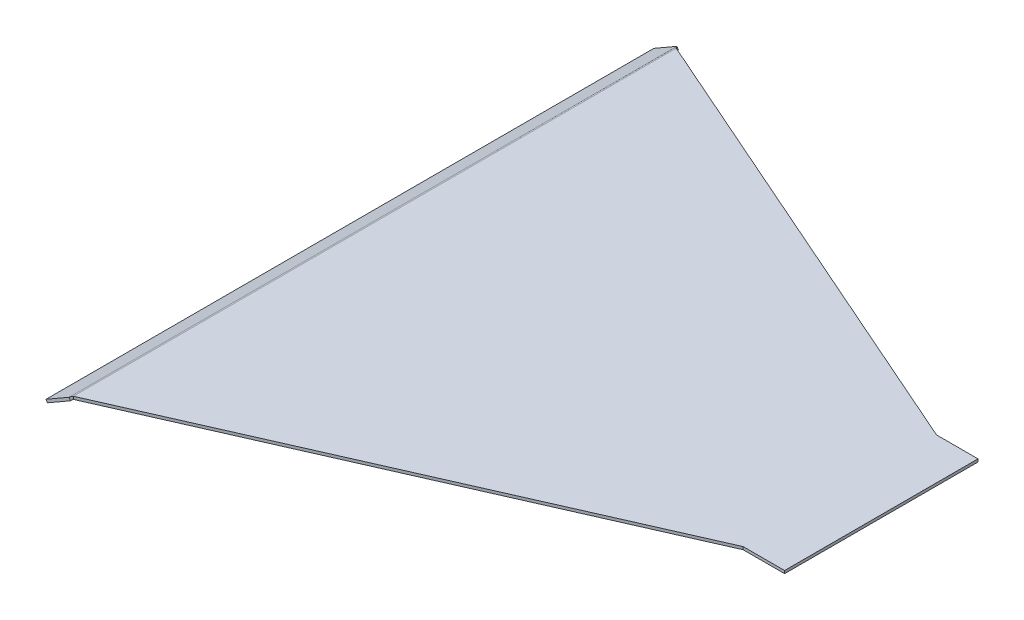
ISO-10303-21;
HEADER;
FILE_DESCRIPTION(('STEP AP214'),'2;1');
FILE_NAME('part.step','',(''),(''),'','','');
FILE_SCHEMA(('AUTOMOTIVE_DESIGN { 1 0 10303 214 1 1 1 1 }'));
ENDSEC;
DATA;
#1=APPLICATION_CONTEXT('core data for automotive mechanical design processes');
#2=APPLICATION_PROTOCOL_DEFINITION('international standard','automotive_design',2000,#1);
#3=PRODUCT_CONTEXT('',#1,'mechanical');
#4=PRODUCT('Part','Part','',(#3));
#5=PRODUCT_RELATED_PRODUCT_CATEGORY('part','',(#4));
#6=PRODUCT_DEFINITION_FORMATION('','',#4);
#7=PRODUCT_DEFINITION_CONTEXT('part definition',#1,'design');
#8=PRODUCT_DEFINITION('design','',#6,#7);
#9=PRODUCT_DEFINITION_SHAPE('','',#8);
#10=(LENGTH_UNIT() NAMED_UNIT(*) SI_UNIT(.MILLI.,.METRE.));
#11=(NAMED_UNIT(*) PLANE_ANGLE_UNIT() SI_UNIT($,.RADIAN.));
#12=(NAMED_UNIT(*) SI_UNIT($,.STERADIAN.) SOLID_ANGLE_UNIT());
#13=UNCERTAINTY_MEASURE_WITH_UNIT(LENGTH_MEASURE(1.E-05),#10,'distance_accuracy_value','');
#14=(GEOMETRIC_REPRESENTATION_CONTEXT(3) GLOBAL_UNCERTAINTY_ASSIGNED_CONTEXT((#13)) GLOBAL_UNIT_ASSIGNED_CONTEXT((#10,
#11,#12)) REPRESENTATION_CONTEXT('',''));
#15=CARTESIAN_POINT('',(0.,0.,0.));
#16=DIRECTION('',(0.,0.,1.));
#17=DIRECTION('',(1.,0.,0.));
#18=AXIS2_PLACEMENT_3D('',#15,#16,#17);
#19=CARTESIAN_POINT('',(177.284922711537,-2.54,3.861523955493));
#20=DIRECTION('',(0.402836786054948,0.,0.915271830551405));
#21=DIRECTION('',(0.915271830551405,0.,-0.402836786054948));
#22=AXIS2_PLACEMENT_3D('',#19,#20,#21);
#23=PLANE('',#22);
#24=DIRECTION('',(0.915271830551405,0.,-0.402836786054948));
#25=VECTOR('',#24,1.);
#26=CARTESIAN_POINT('',(177.284922711537,0.,3.861523955493));
#27=LINE('',#26,#25);
#28=CARTESIAN_POINT('',(-250.266309843892,0.,192.038804898029));
#29=VERTEX_POINT('',#28);
#30=CARTESIAN_POINT('',(177.284922711537,0.,3.861523955493));
#31=VERTEX_POINT('',#30);
#32=EDGE_CURVE('E439',#29,#31,#27,.T.);
#33=ORIENTED_EDGE('',*,*,#32,.F.);
#34=DIRECTION('',(0.,1.,0.));
#35=VECTOR('',#34,1.);
#36=CARTESIAN_POINT('',(-250.266309843892,-2.53999999999999,192.038804898029));
#37=LINE('',#36,#35);
#38=CARTESIAN_POINT('',(-250.266309843892,-2.54,192.038804898029));
#39=VERTEX_POINT('',#38);
#40=EDGE_CURVE('E84',#39,#29,#37,.T.);
#41=ORIENTED_EDGE('',*,*,#40,.F.);
#42=DIRECTION('',(0.915271830551405,0.,-0.402836786054948));
#43=VECTOR('',#42,1.);
#44=CARTESIAN_POINT('',(177.284922711537,-2.54,3.861523955493));
#45=LINE('',#44,#43);
#46=CARTESIAN_POINT('',(177.284922711537,-2.54,3.861523955493));
#47=VERTEX_POINT('',#46);
#48=EDGE_CURVE('E277',#39,#47,#45,.T.);
#49=ORIENTED_EDGE('',*,*,#48,.T.);
#50=DIRECTION('',(0.,1.,0.));
#51=VECTOR('',#50,1.);
#52=CARTESIAN_POINT('',(177.284922711537,-2.54,3.861523955493));
#53=LINE('',#52,#51);
#54=EDGE_CURVE('E443',#47,#31,#53,.T.);
#55=ORIENTED_EDGE('',*,*,#54,.T.);
#56=EDGE_LOOP('',(#33,#41,#49,#55));
#57=FACE_BOUND('',#56,.T.);
#58=ADVANCED_FACE('F59',(#57),#23,.T.);
#59=CARTESIAN_POINT('',(177.284922711537,-2.54,-173.938476044507));
#60=DIRECTION('',(0.402836786054948,0.,-0.915271830551405));
#61=DIRECTION('',(-0.915271830551405,0.,-0.402836786054948));
#62=AXIS2_PLACEMENT_3D('',#59,#60,#61);
#63=PLANE('',#62);
#64=DIRECTION('',(-0.915271830551405,0.,-0.402836786054948));
#65=VECTOR('',#64,1.);
#66=CARTESIAN_POINT('',(177.284922711537,-2.54,-173.938476044507));
#67=LINE('',#66,#65);
#68=CARTESIAN_POINT('',(177.284922711537,-2.54,-173.938476044507));
#69=VERTEX_POINT('',#68);
#70=CARTESIAN_POINT('',(-250.266309843892,-2.54,-362.115756987043));
#71=VERTEX_POINT('',#70);
#72=EDGE_CURVE('E271',#69,#71,#67,.T.);
#73=ORIENTED_EDGE('',*,*,#72,.T.);
#74=DIRECTION('',(0.,1.,0.));
#75=VECTOR('',#74,1.);
#76=CARTESIAN_POINT('',(-250.266309843892,-2.53999999999999,-362.115756987043));
#77=LINE('',#76,#75);
#78=CARTESIAN_POINT('',(-250.266309843892,0.,-362.115756987043));
#79=VERTEX_POINT('',#78);
#80=EDGE_CURVE('E190',#71,#79,#77,.T.);
#81=ORIENTED_EDGE('',*,*,#80,.T.);
#82=DIRECTION('',(-0.915271830551405,0.,-0.402836786054948));
#83=VECTOR('',#82,1.);
#84=CARTESIAN_POINT('',(177.284922711537,0.,-173.938476044507));
#85=LINE('',#84,#83);
#86=CARTESIAN_POINT('',(177.284922711537,0.,-173.938476044507));
#87=VERTEX_POINT('',#86);
#88=EDGE_CURVE('E431',#87,#79,#85,.T.);
#89=ORIENTED_EDGE('',*,*,#88,.F.);
#90=DIRECTION('',(0.,1.,0.));
#91=VECTOR('',#90,1.);
#92=CARTESIAN_POINT('',(177.284922711537,-2.54,-173.938476044507));
#93=LINE('',#92,#91);
#94=EDGE_CURVE('E63',#69,#87,#93,.T.);
#95=ORIENTED_EDGE('',*,*,#94,.F.);
#96=EDGE_LOOP('',(#73,#81,#89,#95));
#97=FACE_BOUND('',#96,.T.);
#98=ADVANCED_FACE('F254',(#97),#63,.T.);
#99=CARTESIAN_POINT('',(0.,-2.54,0.));
#100=DIRECTION('',(0.,-1.,0.));
#101=DIRECTION('',(0.,0.,-1.));
#102=AXIS2_PLACEMENT_3D('',#99,#100,#101);
#103=PLANE('',#102);
#104=ORIENTED_EDGE('',*,*,#48,.F.);
#105=DIRECTION('',(0.,0.,-1.));
#106=VECTOR('',#105,1.);
#107=CARTESIAN_POINT('',(-250.266309843892,-2.53999999999999,-364.438476044507));
#108=LINE('',#107,#106);
#109=EDGE_CURVE('E76',#71,#39,#108,.F.);
#110=ORIENTED_EDGE('',*,*,#109,.F.);
#111=ORIENTED_EDGE('',*,*,#72,.F.);
#112=DIRECTION('',(-1.,0.,0.));
#113=VECTOR('',#112,1.);
#114=CARTESIAN_POINT('',(215.384922711537,-2.54,-173.938476044507));
#115=LINE('',#114,#113);
#116=CARTESIAN_POINT('',(215.384922711537,-2.54,-173.938476044507));
#117=VERTEX_POINT('',#116);
#118=EDGE_CURVE('E236',#117,#69,#115,.T.);
#119=ORIENTED_EDGE('',*,*,#118,.F.);
#120=DIRECTION('',(0.,0.,-1.));
#121=VECTOR('',#120,1.);
#122=CARTESIAN_POINT('',(215.384922711537,-2.54,3.861523955493));
#123=LINE('',#122,#121);
#124=CARTESIAN_POINT('',(215.384922711537,-2.54,3.861523955493));
#125=VERTEX_POINT('',#124);
#126=EDGE_CURVE('E446',#125,#117,#123,.T.);
#127=ORIENTED_EDGE('',*,*,#126,.F.);
#128=DIRECTION('',(1.,0.,0.));
#129=VECTOR('',#128,1.);
#130=CARTESIAN_POINT('',(215.384922711537,-2.54,3.861523955493));
#131=LINE('',#130,#129);
#132=EDGE_CURVE('E448',#47,#125,#131,.T.);
#133=ORIENTED_EDGE('',*,*,#132,.F.);
#134=EDGE_LOOP('',(#104,#110,#111,#119,#127,#133));
#135=FACE_BOUND('',#134,.T.);
#136=ADVANCED_FACE('F244',(#135),#103,.T.);
#137=CARTESIAN_POINT('',(0.,0.,0.));
#138=DIRECTION('',(0.,-1.,0.));
#139=DIRECTION('',(0.,0.,-1.));
#140=AXIS2_PLACEMENT_3D('',#137,#138,#139);
#141=PLANE('',#140);
#142=DIRECTION('',(0.,0.,-1.));
#143=VECTOR('',#142,1.);
#144=CARTESIAN_POINT('',(-250.266309843892,0.,-364.438476044507));
#145=LINE('',#144,#143);
#146=EDGE_CURVE('E184',#79,#29,#145,.F.);
#147=ORIENTED_EDGE('',*,*,#146,.T.);
#148=ORIENTED_EDGE('',*,*,#32,.T.);
#149=DIRECTION('',(1.,0.,0.));
#150=VECTOR('',#149,1.);
#151=CARTESIAN_POINT('',(215.384922711537,0.,3.861523955493));
#152=LINE('',#151,#150);
#153=CARTESIAN_POINT('',(215.384922711537,0.,3.861523955493));
#154=VERTEX_POINT('',#153);
#155=EDGE_CURVE('E437',#31,#154,#152,.T.);
#156=ORIENTED_EDGE('',*,*,#155,.T.);
#157=DIRECTION('',(0.,0.,-1.));
#158=VECTOR('',#157,1.);
#159=CARTESIAN_POINT('',(215.384922711537,0.,3.861523955493));
#160=LINE('',#159,#158);
#161=CARTESIAN_POINT('',(215.384922711537,0.,-173.938476044507));
#162=VERTEX_POINT('',#161);
#163=EDGE_CURVE('E435',#154,#162,#160,.T.);
#164=ORIENTED_EDGE('',*,*,#163,.T.);
#165=DIRECTION('',(-1.,0.,0.));
#166=VECTOR('',#165,1.);
#167=CARTESIAN_POINT('',(215.384922711537,0.,-173.938476044507));
#168=LINE('',#167,#166);
#169=EDGE_CURVE('E189',#162,#87,#168,.T.);
#170=ORIENTED_EDGE('',*,*,#169,.T.);
#171=ORIENTED_EDGE('',*,*,#88,.T.);
#172=EDGE_LOOP('',(#147,#148,#156,#164,#170,#171));
#173=FACE_BOUND('',#172,.T.);
#174=ADVANCED_FACE('F253',(#173),#141,.F.);
#175=CARTESIAN_POINT('',(215.384922711537,-2.54,-173.938476044507));
#176=DIRECTION('',(0.,0.,-1.));
#177=DIRECTION('',(-1.,0.,0.));
#178=AXIS2_PLACEMENT_3D('',#175,#176,#177);
#179=PLANE('',#178);
#180=ORIENTED_EDGE('',*,*,#169,.F.);
#181=DIRECTION('',(0.,1.,0.));
#182=VECTOR('',#181,1.);
#183=CARTESIAN_POINT('',(215.384922711537,-2.54,-173.938476044507));
#184=LINE('',#183,#182);
#185=EDGE_CURVE('E13',#117,#162,#184,.T.);
#186=ORIENTED_EDGE('',*,*,#185,.F.);
#187=ORIENTED_EDGE('',*,*,#118,.T.);
#188=ORIENTED_EDGE('',*,*,#94,.T.);
#189=EDGE_LOOP('',(#180,#186,#187,#188));
#190=FACE_BOUND('',#189,.T.);
#191=ADVANCED_FACE('F61',(#190),#179,.T.);
#192=CARTESIAN_POINT('',(215.384922711537,-2.54,3.861523955493));
#193=DIRECTION('',(1.,0.,0.));
#194=DIRECTION('',(0.,0.,-1.));
#195=AXIS2_PLACEMENT_3D('',#192,#193,#194);
#196=PLANE('',#195);
#197=ORIENTED_EDGE('',*,*,#163,.F.);
#198=DIRECTION('',(0.,1.,0.));
#199=VECTOR('',#198,1.);
#200=CARTESIAN_POINT('',(215.384922711537,-2.54,3.861523955493));
#201=LINE('',#200,#199);
#202=EDGE_CURVE('E68',#125,#154,#201,.T.);
#203=ORIENTED_EDGE('',*,*,#202,.F.);
#204=ORIENTED_EDGE('',*,*,#126,.T.);
#205=ORIENTED_EDGE('',*,*,#185,.T.);
#206=EDGE_LOOP('',(#197,#203,#204,#205));
#207=FACE_BOUND('',#206,.T.);
#208=ADVANCED_FACE('F258',(#207),#196,.T.);
#209=CARTESIAN_POINT('',(215.384922711537,-2.54,3.861523955493));
#210=DIRECTION('',(0.,0.,1.));
#211=DIRECTION('',(1.,0.,0.));
#212=AXIS2_PLACEMENT_3D('',#209,#210,#211);
#213=PLANE('',#212);
#214=ORIENTED_EDGE('',*,*,#155,.F.);
#215=ORIENTED_EDGE('',*,*,#54,.F.);
#216=ORIENTED_EDGE('',*,*,#132,.T.);
#217=ORIENTED_EDGE('',*,*,#202,.T.);
#218=EDGE_LOOP('',(#214,#215,#216,#217));
#219=FACE_BOUND('',#218,.T.);
#220=ADVANCED_FACE('F261',(#219),#213,.T.);
#221=CARTESIAN_POINT('',(-250.266309843892,0.02540000000001,192.038804898029));
#222=CARTESIAN_POINT('',(-250.843023084517,0.02540000000001,192.813593242301));
#223=CARTESIAN_POINT('',(-251.417861526812,-0.128627496391404,193.58673561122));
#224=CARTESIAN_POINT('',(-251.917309843892,-0.416984116703765,194.361523955493));
#225=CARTESIAN_POINT('',(-250.266309843892,0.,192.038804898029));
#226=CARTESIAN_POINT('',(-250.838586009957,0.,192.813588272591));
#227=CARTESIAN_POINT('',(-251.4090041461,-0.152843078927452,193.586740580931));
#228=CARTESIAN_POINT('',(-251.904609843892,-0.43898116195989,194.361523955493));
#229=CARTESIAN_POINT('',(-250.266309843892,-2.53999999999999,192.038804898029));
#230=CARTESIAN_POINT('',(-250.394878553973,-2.53999999999999,192.813091301536));
#231=CARTESIAN_POINT('',(-250.523266074831,-2.5744013325322,193.587237551986));
#232=CARTESIAN_POINT('',(-250.634609843892,-2.63868568757237,194.361523955493));
#233=B_SPLINE_SURFACE_WITH_KNOTS('',1,3,((#221,#222,#223,#224),(#225,#226,#227,#228),(#229,#230,
#231,#232)),.UNSPECIFIED.,.F.,.F.,.F.,(2,1,2),(4,4),(-0.01,0.,1.),(0.,1.),.UNSPECIFIED.);
#234=DIRECTION('',(0.499999999999995,-0.866025403784442,0.));
#235=VECTOR('',#234,1.);
#236=CARTESIAN_POINT('',(-251.904609843892,-0.438981161959897,194.361523955493));
#237=LINE('',#236,#235);
#238=CARTESIAN_POINT('',(-250.634609843892,-2.63868568757237,194.361523955493));
#239=VERTEX_POINT('',#238);
#240=CARTESIAN_POINT('',(-251.904609843892,-0.438981161959888,194.361523955493));
#241=VERTEX_POINT('',#240);
#242=EDGE_CURVE('E163',#239,#241,#237,.F.);
#243=CARTESIAN_POINT('',(-250.266309843892,-2.53999999999999,192.038804898029));
#244=CARTESIAN_POINT('',(-250.286420869529,-2.53999919632273,192.159929588063));
#245=CARTESIAN_POINT('',(-250.306530603025,-2.54082404376188,192.281052028278));
#246=CARTESIAN_POINT('',(-250.346616418067,-2.54411460282511,192.523296903589));
#247=CARTESIAN_POINT('',(-250.366592499433,-2.54658031666439,192.644419338684));
#248=CARTESIAN_POINT('',(-250.429994685421,-2.55706313986049,193.03142183373));
#249=CARTESIAN_POINT('',(-250.472915285593,-2.56819303857578,193.297309840435));
#250=CARTESIAN_POINT('',(-250.535289102624,-2.59051018561596,193.696245475517));
#251=CARTESIAN_POINT('',(-250.555754492461,-2.59889125089677,193.829300329881));
#252=CARTESIAN_POINT('',(-250.595849182464,-2.61745533018736,194.095410545766));
#253=CARTESIAN_POINT('',(-250.615478481154,-2.6276383473778,194.228465907288));
#254=CARTESIAN_POINT('',(-250.634609843892,-2.63868568757237,194.361523955493));
#255=B_SPLINE_CURVE_WITH_KNOTS('',3,(#243,#244,#245,#246,#247,#248,#249,#250,#251,#252,#253,
#254),.UNSPECIFIED.,.F.,.F.,(4,2,2,2,2,4),(0.,0.368341131156363,0.736682759584203,
1.54522202700705,1.94985076032581,2.35448020787166),.UNSPECIFIED.);
#256=EDGE_CURVE('E182',#39,#239,#255,.T.);
#257=CARTESIAN_POINT('',(-250.266309843892,0.,192.038804898029));
#258=CARTESIAN_POINT('',(-250.336963209605,4.68194257623094E-07,192.134463120492));
#259=CARTESIAN_POINT('',(-250.407603455101,-0.00228604253869027,192.230110535098));
#260=CARTESIAN_POINT('',(-250.548594892375,-0.0114176955517788,192.42141368005));
#261=CARTESIAN_POINT('',(-250.618946058397,-0.0182632355220594,192.517069410393));
#262=CARTESIAN_POINT('',(-250.829012499123,-0.0455965076171281,192.803876950465));
#263=CARTESIAN_POINT('',(-250.967883604388,-0.0728809624683941,192.995061019315));
#264=CARTESIAN_POINT('',(-251.174117655806,-0.127440245583043,193.283839012851));
#265=CARTESIAN_POINT('',(-251.243235370518,-0.148193121201203,193.381474080443));
#266=CARTESIAN_POINT('',(-251.379945550373,-0.194211118888219,193.576746118963));
#267=CARTESIAN_POINT('',(-251.447538157854,-0.219475817891139,193.674383088857));
#268=CARTESIAN_POINT('',(-251.581314154068,-0.274577944986102,193.870265158028));
#269=CARTESIAN_POINT('',(-251.647486219983,-0.30444272894121,193.968510277919));
#270=CARTESIAN_POINT('',(-251.777710658504,-0.368499841556763,194.165012080214));
#271=CARTESIAN_POINT('',(-251.841762784861,-0.402692670748014,194.263268762639));
#272=CARTESIAN_POINT('',(-251.904609843892,-0.43898116195989,194.361523955493));
#273=B_SPLINE_CURVE_WITH_KNOTS('',3,(#257,#258,#259,#260,#261,#262,#263,#264,#265,#266,#267,
#268,#269,#270,#271,#272),.UNSPECIFIED.,.F.,.F.,(4,2,2,2,2,2,2,4),(0.,0.356710539132978,
0.713452198673621,1.42621955999697,1.79038025427895,2.15450681974993,2.52088892837652,
2.88731344722786),.UNSPECIFIED.);
#274=EDGE_CURVE('E186',#29,#241,#273,.T.);
#275=ORIENTED_EDGE('',*,*,#242,.F.);
#276=ORIENTED_EDGE('',*,*,#256,.F.);
#277=ORIENTED_EDGE('',*,*,#40,.T.);
#278=ORIENTED_EDGE('',*,*,#274,.T.);
#279=EDGE_LOOP('',(#275,#276,#277,#278));
#280=FACE_BOUND('',#279,.T.);
#281=ADVANCED_FACE('F206',(#280),#233,.F.);
#282=CARTESIAN_POINT('',(-251.917309843892,-0.416984116703765,-364.438476044507));
#283=CARTESIAN_POINT('',(-251.417861526813,-0.128627496391421,-363.663687700234));
#284=CARTESIAN_POINT('',(-250.843023084517,0.02540000000001,-362.890545331315));
#285=CARTESIAN_POINT('',(-250.266309843892,0.02540000000001,-362.115756987043));
#286=CARTESIAN_POINT('',(-251.904609843892,-0.43898116195989,-364.438476044507));
#287=CARTESIAN_POINT('',(-251.4090041461,-0.152843078927468,-363.663692669945));
#288=CARTESIAN_POINT('',(-250.838586009957,0.,-362.890540361605));
#289=CARTESIAN_POINT('',(-250.266309843892,0.,-362.115756987043));
#290=CARTESIAN_POINT('',(-250.634609843892,-2.63868568757237,-364.438476044507));
#291=CARTESIAN_POINT('',(-250.523266074831,-2.57440133253212,-363.664189640998));
#292=CARTESIAN_POINT('',(-250.394878553973,-2.53999999999999,-362.890043390551));
#293=CARTESIAN_POINT('',(-250.266309843892,-2.53999999999999,-362.115756987043));
#294=B_SPLINE_SURFACE_WITH_KNOTS('',1,3,((#282,#283,#284,#285),(#286,#287,#288,#289),(#290,#291,
#292,#293)),.UNSPECIFIED.,.F.,.F.,.F.,(2,1,2),(4,4),(-0.01,0.,1.),(0.,1.),.UNSPECIFIED.);
#295=CARTESIAN_POINT('',(-250.634609843892,-2.63868568757237,-364.438476044507));
#296=CARTESIAN_POINT('',(-250.617193586633,-2.62862947874911,-364.317351354473));
#297=CARTESIAN_POINT('',(-250.599365622843,-2.61928895083767,-364.196228914257));
#298=CARTESIAN_POINT('',(-250.563005009154,-2.60209575105804,-363.953984038947));
#299=CARTESIAN_POINT('',(-250.544472358303,-2.59424308119852,-363.832861603852));
#300=CARTESIAN_POINT('',(-250.484323042984,-2.57162037939547,-363.445859108806));
#301=CARTESIAN_POINT('',(-250.441587763532,-2.55979885433859,-363.179971102101));
#302=CARTESIAN_POINT('',(-250.376411879932,-2.54793916210004,-362.781035467019));
#303=CARTESIAN_POINT('',(-250.354497799794,-2.5449646826255,-362.647980612655));
#304=CARTESIAN_POINT('',(-250.31049274005,-2.54099430188746,-362.38187039677));
#305=CARTESIAN_POINT('',(-250.28840176013,-2.53999840411643,-362.248815035248));
#306=CARTESIAN_POINT('',(-250.266309843892,-2.53999999999999,-362.115756987043));
#307=B_SPLINE_CURVE_WITH_KNOTS('',3,(#295,#296,#297,#298,#299,#300,#301,#302,#303,#304,#305,
#306),.UNSPECIFIED.,.F.,.F.,(4,2,2,2,2,4),(0.,0.368341131156433,0.736682759584198,
1.54522202700704,1.94985076032577,2.35448020787166),.UNSPECIFIED.);
#308=CARTESIAN_POINT('',(-250.634609843892,-2.63868568757237,-364.438476044507));
#309=VERTEX_POINT('',#308);
#310=EDGE_CURVE('E183',#309,#71,#307,.T.);
#311=DIRECTION('',(0.499999999999995,-0.866025403784442,0.));
#312=VECTOR('',#311,1.);
#313=CARTESIAN_POINT('',(-250.634609843892,-2.63868568757239,-364.438476044507));
#314=LINE('',#313,#312);
#315=CARTESIAN_POINT('',(-251.904609843892,-0.438981161959891,-364.438476044507));
#316=VERTEX_POINT('',#315);
#317=EDGE_CURVE('E175',#309,#316,#314,.F.);
#318=CARTESIAN_POINT('',(-251.904609843892,-0.438981161959889,-364.438476044507));
#319=CARTESIAN_POINT('',(-251.843422468419,-0.403654073635175,-364.342817822044));
#320=CARTESIAN_POINT('',(-251.781102965924,-0.370314127268106,-364.247170407438));
#321=CARTESIAN_POINT('',(-251.654434973022,-0.307726652119147,-364.055867262486));
#322=CARTESIAN_POINT('',(-251.590086306075,-0.278479480624773,-363.960211532143));
#323=CARTESIAN_POINT('',(-251.394496795877,-0.197117568264987,-363.673403992071));
#324=CARTESIAN_POINT('',(-251.26058866344,-0.151311046662042,-363.482219923221));
#325=CARTESIAN_POINT('',(-251.054705094229,-0.0954437461423046,-363.193441929685));
#326=CARTESIAN_POINT('',(-250.984470959629,-0.0788574062735271,-363.095806862093));
#327=CARTESIAN_POINT('',(-250.843067472075,-0.0503550713743321,-362.900534823572));
#328=CARTESIAN_POINT('',(-250.771898207386,-0.0384386387891018,-362.802897853679));
#329=CARTESIAN_POINT('',(-250.628493732701,-0.0192704825488334,-362.607015784508));
#330=CARTESIAN_POINT('',(-250.55625465062,-0.0120481111750895,-362.508770664617));
#331=CARTESIAN_POINT('',(-250.411448422359,-0.00241097873251318,-362.312268862322));
#332=CARTESIAN_POINT('',(-250.338881239172,3.22573902742264E-06,-362.214012179897));
#333=CARTESIAN_POINT('',(-250.266309843892,0.,-362.115756987043));
#334=B_SPLINE_CURVE_WITH_KNOTS('',3,(#318,#319,#320,#321,#322,#323,#324,#325,#326,#327,#328,
#329,#330,#331,#332,#333),.UNSPECIFIED.,.F.,.F.,(4,2,2,2,2,2,2,4),(0.,0.356710539132968,
0.713452198673736,1.4262195599971,1.79038025427904,2.15450681975,2.52088892837653,
2.88731344722786),.UNSPECIFIED.);
#335=EDGE_CURVE('E187',#316,#79,#334,.T.);
#336=ORIENTED_EDGE('',*,*,#310,.F.);
#337=ORIENTED_EDGE('',*,*,#317,.T.);
#338=ORIENTED_EDGE('',*,*,#335,.T.);
#339=ORIENTED_EDGE('',*,*,#80,.F.);
#340=EDGE_LOOP('',(#336,#337,#338,#339));
#341=FACE_BOUND('',#340,.T.);
#342=ADVANCED_FACE('F216',(#341),#294,.F.);
#343=CARTESIAN_POINT('',(-250.266309843892,-3.27659999999997,-364.438476044507));
#344=DIRECTION('',(0.,0.,-1.));
#345=DIRECTION('',(-0.499999999999995,0.866025403784442,0.));
#346=AXIS2_PLACEMENT_3D('',#343,#344,#345);
#347=CYLINDRICAL_SURFACE('',#346,3.27659999999998);
#348=ORIENTED_EDGE('',*,*,#146,.F.);
#349=ORIENTED_EDGE('',*,*,#335,.F.);
#350=DIRECTION('',(0.,0.,-1.));
#351=VECTOR('',#350,1.);
#352=CARTESIAN_POINT('',(-251.904609843892,-0.438981161959884,194.361523955493));
#353=LINE('',#352,#351);
#354=EDGE_CURVE('E173',#316,#241,#353,.F.);
#355=ORIENTED_EDGE('',*,*,#354,.T.);
#356=ORIENTED_EDGE('',*,*,#274,.F.);
#357=EDGE_LOOP('',(#348,#349,#355,#356));
#358=FACE_BOUND('',#357,.T.);
#359=ADVANCED_FACE('F211',(#358),#347,.T.);
#360=CARTESIAN_POINT('',(-250.266309843892,-3.27659999999997,-364.438476044507));
#361=DIRECTION('',(0.,0.,-1.));
#362=DIRECTION('',(-0.499999999999995,0.866025403784442,0.));
#363=AXIS2_PLACEMENT_3D('',#360,#361,#362);
#364=CYLINDRICAL_SURFACE('',#363,0.736599999999981);
#365=ORIENTED_EDGE('',*,*,#109,.T.);
#366=ORIENTED_EDGE('',*,*,#256,.T.);
#367=DIRECTION('',(0.,0.,-1.));
#368=VECTOR('',#367,1.);
#369=CARTESIAN_POINT('',(-250.634609843892,-2.63868568757237,194.361523955493));
#370=LINE('',#369,#368);
#371=EDGE_CURVE('E178',#239,#309,#370,.T.);
#372=ORIENTED_EDGE('',*,*,#371,.T.);
#373=ORIENTED_EDGE('',*,*,#310,.T.);
#374=EDGE_LOOP('',(#365,#366,#372,#373));
#375=FACE_BOUND('',#374,.T.);
#376=ADVANCED_FACE('F215',(#375),#364,.F.);
#377=CARTESIAN_POINT('',(-273.141317423937,-12.6999999999999,-364.438476044507));
#378=DIRECTION('',(0.,0.,1.));
#379=DIRECTION('',(1.,0.,0.));
#380=AXIS2_PLACEMENT_3D('',#377,#378,#379);
#381=PLANE('',#380);
#382=ORIENTED_EDGE('',*,*,#317,.F.);
#383=DIRECTION('',(0.866025403784442,0.499999999999995,0.));
#384=VECTOR('',#383,1.);
#385=CARTESIAN_POINT('',(-271.871317423937,-14.8997045256124,-364.438476044507));
#386=LINE('',#385,#384);
#387=CARTESIAN_POINT('',(-271.871317423937,-14.8997045256124,-364.438476044507));
#388=VERTEX_POINT('',#387);
#389=EDGE_CURVE('E171',#309,#388,#386,.F.);
#390=ORIENTED_EDGE('',*,*,#389,.T.);
#391=DIRECTION('',(0.499999999999995,-0.866025403784442,0.));
#392=VECTOR('',#391,1.);
#393=CARTESIAN_POINT('',(-273.141317423937,-12.6999999999999,-364.438476044507));
#394=LINE('',#393,#392);
#395=CARTESIAN_POINT('',(-273.141317423937,-12.6999999999999,-364.438476044507));
#396=VERTEX_POINT('',#395);
#397=EDGE_CURVE('E159',#396,#388,#394,.T.);
#398=ORIENTED_EDGE('',*,*,#397,.F.);
#399=DIRECTION('',(-0.866025403784442,-0.499999999999995,0.));
#400=VECTOR('',#399,1.);
#401=CARTESIAN_POINT('',(-58.9760680419517,110.948364381751,-364.438476044507));
#402=LINE('',#401,#400);
#403=EDGE_CURVE('E146',#316,#396,#402,.T.);
#404=ORIENTED_EDGE('',*,*,#403,.F.);
#405=EDGE_LOOP('',(#382,#390,#398,#404));
#406=FACE_BOUND('',#405,.T.);
#407=ADVANCED_FACE('F218',(#406),#381,.F.);
#408=CARTESIAN_POINT('',(-251.733681219037,-0.340295474387547,194.361523955493));
#409=DIRECTION('',(0.,0.,-1.));
#410=DIRECTION('',(-1.,0.,0.));
#411=AXIS2_PLACEMENT_3D('',#408,#409,#410);
#412=PLANE('',#411);
#413=ORIENTED_EDGE('',*,*,#242,.T.);
#414=DIRECTION('',(0.866025403784442,0.499999999999995,0.));
#415=VECTOR('',#414,1.);
#416=CARTESIAN_POINT('',(-58.9760680419517,110.948364381751,194.361523955493));
#417=LINE('',#416,#415);
#418=CARTESIAN_POINT('',(-273.141317423937,-12.6999999999999,194.361523955493));
#419=VERTEX_POINT('',#418);
#420=EDGE_CURVE('E144',#419,#241,#417,.T.);
#421=ORIENTED_EDGE('',*,*,#420,.F.);
#422=DIRECTION('',(0.499999999999995,-0.866025403784442,0.));
#423=VECTOR('',#422,1.);
#424=CARTESIAN_POINT('',(-273.141317423937,-12.6999999999999,194.361523955493));
#425=LINE('',#424,#423);
#426=CARTESIAN_POINT('',(-271.871317423937,-14.8997045256124,194.361523955493));
#427=VERTEX_POINT('',#426);
#428=EDGE_CURVE('E152',#419,#427,#425,.T.);
#429=ORIENTED_EDGE('',*,*,#428,.T.);
#430=DIRECTION('',(-0.866025403784442,-0.499999999999995,0.));
#431=VECTOR('',#430,1.);
#432=CARTESIAN_POINT('',(-250.463681219037,-2.54000000000002,194.361523955493));
#433=LINE('',#432,#431);
#434=EDGE_CURVE('E168',#427,#239,#433,.F.);
#435=ORIENTED_EDGE('',*,*,#434,.T.);
#436=EDGE_LOOP('',(#413,#421,#429,#435));
#437=FACE_BOUND('',#436,.T.);
#438=ADVANCED_FACE('F162',(#437),#412,.F.);
#439=CARTESIAN_POINT('',(-58.9760680419517,110.948364381751,0.));
#440=DIRECTION('',(0.499999999999995,-0.866025403784442,0.));
#441=DIRECTION('',(0.866025403784442,0.499999999999995,0.));
#442=AXIS2_PLACEMENT_3D('',#439,#440,#441);
#443=PLANE('',#442);
#444=ORIENTED_EDGE('',*,*,#354,.F.);
#445=ORIENTED_EDGE('',*,*,#403,.T.);
#446=DIRECTION('',(0.,0.,1.));
#447=VECTOR('',#446,1.);
#448=CARTESIAN_POINT('',(-273.141317423937,-12.6999999999999,0.));
#449=LINE('',#448,#447);
#450=EDGE_CURVE('E139',#396,#419,#449,.T.);
#451=ORIENTED_EDGE('',*,*,#450,.T.);
#452=ORIENTED_EDGE('',*,*,#420,.T.);
#453=EDGE_LOOP('',(#444,#445,#451,#452));
#454=FACE_BOUND('',#453,.T.);
#455=ADVANCED_FACE('F142',(#454),#443,.F.);
#456=CARTESIAN_POINT('',(-57.7060680419517,108.748659856138,0.));
#457=DIRECTION('',(0.499999999999995,-0.866025403784442,0.));
#458=DIRECTION('',(0.866025403784442,0.499999999999995,0.));
#459=AXIS2_PLACEMENT_3D('',#456,#457,#458);
#460=PLANE('',#459);
#461=ORIENTED_EDGE('',*,*,#389,.F.);
#462=ORIENTED_EDGE('',*,*,#371,.F.);
#463=ORIENTED_EDGE('',*,*,#434,.F.);
#464=DIRECTION('',(0.,0.,-1.));
#465=VECTOR('',#464,1.);
#466=CARTESIAN_POINT('',(-271.871317423937,-14.8997045256124,194.361523955493));
#467=LINE('',#466,#465);
#468=EDGE_CURVE('E155',#388,#427,#467,.F.);
#469=ORIENTED_EDGE('',*,*,#468,.F.);
#470=EDGE_LOOP('',(#461,#462,#463,#469));
#471=FACE_BOUND('',#470,.T.);
#472=ADVANCED_FACE('F286',(#471),#460,.T.);
#473=CARTESIAN_POINT('',(-273.141317423937,-12.6999999999999,194.361523955493));
#474=DIRECTION('',(0.866025403784441,0.499999999999995,0.));
#475=DIRECTION('',(-0.499999999999995,0.866025403784442,0.));
#476=AXIS2_PLACEMENT_3D('',#473,#474,#475);
#477=PLANE('',#476);
#478=ORIENTED_EDGE('',*,*,#468,.T.);
#479=ORIENTED_EDGE('',*,*,#428,.F.);
#480=ORIENTED_EDGE('',*,*,#450,.F.);
#481=ORIENTED_EDGE('',*,*,#397,.T.);
#482=EDGE_LOOP('',(#478,#479,#480,#481));
#483=FACE_BOUND('',#482,.T.);
#484=ADVANCED_FACE('F153',(#483),#477,.F.);
#485=CLOSED_SHELL('',(#58,#98,#136,#174,#191,#208,#220,#281,#342,#359,#376,#407,#438,#455,#472,#484));
#486=MANIFOLD_SOLID_BREP('B2',#485);
#487=ADVANCED_BREP_SHAPE_REPRESENTATION('',(#18,#486),#14);
#488=SHAPE_DEFINITION_REPRESENTATION(#9,#487);
ENDSEC;
END-ISO-10303-21;
